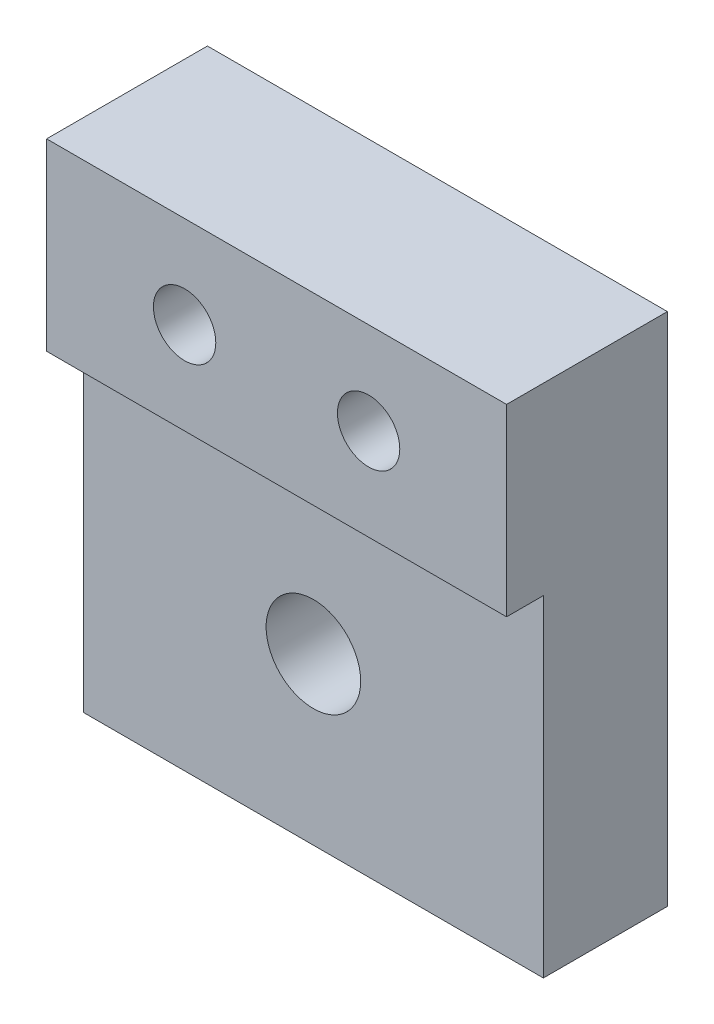
ISO-10303-21;
HEADER;
FILE_DESCRIPTION(('STEP AP214'),'2;1');
FILE_NAME('part.step','',(''),(''),'','','');
FILE_SCHEMA(('AUTOMOTIVE_DESIGN { 1 0 10303 214 1 1 1 1 }'));
ENDSEC;
DATA;
#1=APPLICATION_CONTEXT('core data for automotive mechanical design processes');
#2=APPLICATION_PROTOCOL_DEFINITION('international standard','automotive_design',2000,#1);
#3=PRODUCT_CONTEXT('',#1,'mechanical');
#4=PRODUCT('Part','Part','',(#3));
#5=PRODUCT_RELATED_PRODUCT_CATEGORY('part','',(#4));
#6=PRODUCT_DEFINITION_FORMATION('','',#4);
#7=PRODUCT_DEFINITION_CONTEXT('part definition',#1,'design');
#8=PRODUCT_DEFINITION('design','',#6,#7);
#9=PRODUCT_DEFINITION_SHAPE('','',#8);
#10=(LENGTH_UNIT() NAMED_UNIT(*) SI_UNIT(.MILLI.,.METRE.));
#11=(NAMED_UNIT(*) PLANE_ANGLE_UNIT() SI_UNIT($,.RADIAN.));
#12=(NAMED_UNIT(*) SI_UNIT($,.STERADIAN.) SOLID_ANGLE_UNIT());
#13=UNCERTAINTY_MEASURE_WITH_UNIT(LENGTH_MEASURE(1.E-05),#10,'distance_accuracy_value','');
#14=(GEOMETRIC_REPRESENTATION_CONTEXT(3) GLOBAL_UNCERTAINTY_ASSIGNED_CONTEXT((#13)) GLOBAL_UNIT_ASSIGNED_CONTEXT((#10,
#11,#12)) REPRESENTATION_CONTEXT('',''));
#15=CARTESIAN_POINT('',(0.,0.,0.));
#16=DIRECTION('',(0.,0.,1.));
#17=DIRECTION('',(1.,0.,0.));
#18=AXIS2_PLACEMENT_3D('',#15,#16,#17);
#19=CARTESIAN_POINT('',(0.,35.56,11.0998));
#20=DIRECTION('',(0.,1.,0.));
#21=DIRECTION('',(0.,0.,1.));
#22=AXIS2_PLACEMENT_3D('',#19,#20,#21);
#23=PLANE('',#22);
#24=DIRECTION('',(1.,0.,0.));
#25=VECTOR('',#24,1.);
#26=CARTESIAN_POINT('',(0.,35.56,0.));
#27=LINE('',#26,#25);
#28=CARTESIAN_POINT('',(0.,35.56,0.));
#29=VERTEX_POINT('',#28);
#30=CARTESIAN_POINT('',(31.75,35.56,0.));
#31=VERTEX_POINT('',#30);
#32=EDGE_CURVE('E148',#29,#31,#27,.T.);
#33=ORIENTED_EDGE('',*,*,#32,.F.);
#34=DIRECTION('',(0.,0.,-1.));
#35=VECTOR('',#34,1.);
#36=CARTESIAN_POINT('',(0.,35.56,11.0998));
#37=LINE('',#36,#35);
#38=CARTESIAN_POINT('',(0.,35.56,11.0998));
#39=VERTEX_POINT('',#38);
#40=EDGE_CURVE('E11',#39,#29,#37,.T.);
#41=ORIENTED_EDGE('',*,*,#40,.F.);
#42=DIRECTION('',(1.,0.,0.));
#43=VECTOR('',#42,1.);
#44=CARTESIAN_POINT('',(0.,35.56,11.0998));
#45=LINE('',#44,#43);
#46=CARTESIAN_POINT('',(31.75,35.56,11.0998));
#47=VERTEX_POINT('',#46);
#48=EDGE_CURVE('E138',#39,#47,#45,.T.);
#49=ORIENTED_EDGE('',*,*,#48,.T.);
#50=DIRECTION('',(0.,0.,-1.));
#51=VECTOR('',#50,1.);
#52=CARTESIAN_POINT('',(31.75,35.56,11.0998));
#53=LINE('',#52,#51);
#54=EDGE_CURVE('E80',#47,#31,#53,.T.);
#55=ORIENTED_EDGE('',*,*,#54,.T.);
#56=EDGE_LOOP('',(#33,#41,#49,#55));
#57=FACE_BOUND('',#56,.T.);
#58=ADVANCED_FACE('F42',(#57),#23,.T.);
#59=CARTESIAN_POINT('',(0.,0.,11.0998));
#60=DIRECTION('',(1.,0.,0.));
#61=DIRECTION('',(0.,1.,0.));
#62=AXIS2_PLACEMENT_3D('',#59,#60,#61);
#63=PLANE('',#62);
#64=DIRECTION('',(0.,-1.,0.));
#65=VECTOR('',#64,1.);
#66=CARTESIAN_POINT('',(0.,0.,0.));
#67=LINE('',#66,#65);
#68=CARTESIAN_POINT('',(0.,0.,0.));
#69=VERTEX_POINT('',#68);
#70=EDGE_CURVE('E121',#29,#69,#67,.T.);
#71=ORIENTED_EDGE('',*,*,#70,.T.);
#72=DIRECTION('',(0.,0.,-1.));
#73=VECTOR('',#72,1.);
#74=CARTESIAN_POINT('',(0.,0.,8.5598));
#75=LINE('',#74,#73);
#76=CARTESIAN_POINT('',(0.,0.,8.5598));
#77=VERTEX_POINT('',#76);
#78=EDGE_CURVE('E107',#77,#69,#75,.T.);
#79=ORIENTED_EDGE('',*,*,#78,.F.);
#80=DIRECTION('',(0.,-1.,0.));
#81=VECTOR('',#80,1.);
#82=CARTESIAN_POINT('',(0.,0.,8.5598));
#83=LINE('',#82,#81);
#84=CARTESIAN_POINT('',(0.,22.86,8.5598));
#85=VERTEX_POINT('',#84);
#86=EDGE_CURVE('E110',#85,#77,#83,.T.);
#87=ORIENTED_EDGE('',*,*,#86,.F.);
#88=DIRECTION('',(0.,0.,-1.));
#89=VECTOR('',#88,1.);
#90=CARTESIAN_POINT('',(0.,22.86,11.0998));
#91=LINE('',#90,#89);
#92=CARTESIAN_POINT('',(0.,22.86,11.0998));
#93=VERTEX_POINT('',#92);
#94=EDGE_CURVE('E50',#93,#85,#91,.T.);
#95=ORIENTED_EDGE('',*,*,#94,.F.);
#96=DIRECTION('',(0.,-1.,0.));
#97=VECTOR('',#96,1.);
#98=CARTESIAN_POINT('',(0.,0.,11.0998));
#99=LINE('',#98,#97);
#100=EDGE_CURVE('E140',#39,#93,#99,.T.);
#101=ORIENTED_EDGE('',*,*,#100,.F.);
#102=ORIENTED_EDGE('',*,*,#40,.T.);
#103=EDGE_LOOP('',(#71,#79,#87,#95,#101,#102));
#104=FACE_BOUND('',#103,.T.);
#105=ADVANCED_FACE('F119',(#104),#63,.F.);
#106=CARTESIAN_POINT('',(0.,22.86,11.0998));
#107=DIRECTION('',(0.,1.,0.));
#108=DIRECTION('',(0.,0.,1.));
#109=AXIS2_PLACEMENT_3D('',#106,#107,#108);
#110=PLANE('',#109);
#111=ORIENTED_EDGE('',*,*,#94,.T.);
#112=DIRECTION('',(1.,0.,0.));
#113=VECTOR('',#112,1.);
#114=CARTESIAN_POINT('',(0.,22.86,8.5598));
#115=LINE('',#114,#113);
#116=CARTESIAN_POINT('',(31.75,22.86,8.5598));
#117=VERTEX_POINT('',#116);
#118=EDGE_CURVE('E113',#85,#117,#115,.T.);
#119=ORIENTED_EDGE('',*,*,#118,.T.);
#120=DIRECTION('',(0.,0.,-1.));
#121=VECTOR('',#120,1.);
#122=CARTESIAN_POINT('',(31.75,22.86,11.0998));
#123=LINE('',#122,#121);
#124=CARTESIAN_POINT('',(31.75,22.86,11.0998));
#125=VERTEX_POINT('',#124);
#126=EDGE_CURVE('E154',#125,#117,#123,.T.);
#127=ORIENTED_EDGE('',*,*,#126,.F.);
#128=DIRECTION('',(1.,0.,0.));
#129=VECTOR('',#128,1.);
#130=CARTESIAN_POINT('',(0.,22.86,11.0998));
#131=LINE('',#130,#129);
#132=EDGE_CURVE('E143',#93,#125,#131,.T.);
#133=ORIENTED_EDGE('',*,*,#132,.F.);
#134=EDGE_LOOP('',(#111,#119,#127,#133));
#135=FACE_BOUND('',#134,.T.);
#136=ADVANCED_FACE('F157',(#135),#110,.F.);
#137=CARTESIAN_POINT('',(22.225,29.21,11.0998));
#138=DIRECTION('',(0.,0.,-1.));
#139=DIRECTION('',(-1.,0.,0.));
#140=AXIS2_PLACEMENT_3D('',#137,#138,#139);
#141=CYLINDRICAL_SURFACE('',#140,2.15265);
#142=CARTESIAN_POINT('',(22.225,29.21,11.0998));
#143=DIRECTION('',(0.,0.,1.));
#144=DIRECTION('',(1.,0.,0.));
#145=AXIS2_PLACEMENT_3D('',#142,#143,#144);
#146=CIRCLE('',#145,2.15265);
#147=CARTESIAN_POINT('',(24.37765,29.21,11.0998));
#148=VERTEX_POINT('',#147);
#149=EDGE_CURVE('E134',#148,#148,#146,.T.);
#150=ORIENTED_EDGE('',*,*,#149,.T.);
#151=EDGE_LOOP('',(#150));
#152=FACE_BOUND('',#151,.T.);
#153=CARTESIAN_POINT('',(22.225,29.21,0.));
#154=DIRECTION('',(0.,0.,1.));
#155=DIRECTION('',(1.,0.,0.));
#156=AXIS2_PLACEMENT_3D('',#153,#154,#155);
#157=CIRCLE('',#156,2.15265);
#158=CARTESIAN_POINT('',(24.37765,29.21,0.));
#159=VERTEX_POINT('',#158);
#160=EDGE_CURVE('E126',#159,#159,#157,.T.);
#161=ORIENTED_EDGE('',*,*,#160,.F.);
#162=EDGE_LOOP('',(#161));
#163=FACE_BOUND('',#162,.T.);
#164=ADVANCED_FACE('F168',(#152,#163),#141,.F.);
#165=CARTESIAN_POINT('',(9.52500000000001,29.21,11.0998));
#166=DIRECTION('',(0.,0.,-1.));
#167=DIRECTION('',(-1.,0.,0.));
#168=AXIS2_PLACEMENT_3D('',#165,#166,#167);
#169=CYLINDRICAL_SURFACE('',#168,2.15265);
#170=CARTESIAN_POINT('',(9.52500000000001,29.21,11.0998));
#171=DIRECTION('',(0.,0.,1.));
#172=DIRECTION('',(1.,0.,0.));
#173=AXIS2_PLACEMENT_3D('',#170,#171,#172);
#174=CIRCLE('',#173,2.15265);
#175=CARTESIAN_POINT('',(11.67765,29.21,11.0998));
#176=VERTEX_POINT('',#175);
#177=EDGE_CURVE('E131',#176,#176,#174,.T.);
#178=ORIENTED_EDGE('',*,*,#177,.T.);
#179=EDGE_LOOP('',(#178));
#180=FACE_BOUND('',#179,.T.);
#181=CARTESIAN_POINT('',(9.52500000000001,29.21,0.));
#182=DIRECTION('',(0.,0.,1.));
#183=DIRECTION('',(1.,0.,0.));
#184=AXIS2_PLACEMENT_3D('',#181,#182,#183);
#185=CIRCLE('',#184,2.15265);
#186=CARTESIAN_POINT('',(11.67765,29.21,0.));
#187=VERTEX_POINT('',#186);
#188=EDGE_CURVE('E123',#187,#187,#185,.T.);
#189=ORIENTED_EDGE('',*,*,#188,.F.);
#190=EDGE_LOOP('',(#189));
#191=FACE_BOUND('',#190,.T.);
#192=ADVANCED_FACE('F44',(#180,#191),#169,.F.);
#193=CARTESIAN_POINT('',(31.75,0.,11.0998));
#194=DIRECTION('',(-1.,0.,0.));
#195=DIRECTION('',(0.,0.,1.));
#196=AXIS2_PLACEMENT_3D('',#193,#194,#195);
#197=PLANE('',#196);
#198=DIRECTION('',(0.,1.,0.));
#199=VECTOR('',#198,1.);
#200=CARTESIAN_POINT('',(31.75,0.,0.));
#201=LINE('',#200,#199);
#202=CARTESIAN_POINT('',(31.75,0.,0.));
#203=VERTEX_POINT('',#202);
#204=EDGE_CURVE('E135',#203,#31,#201,.T.);
#205=ORIENTED_EDGE('',*,*,#204,.T.);
#206=ORIENTED_EDGE('',*,*,#54,.F.);
#207=DIRECTION('',(0.,1.,0.));
#208=VECTOR('',#207,1.);
#209=CARTESIAN_POINT('',(31.75,0.,11.0998));
#210=LINE('',#209,#208);
#211=EDGE_CURVE('E66',#125,#47,#210,.T.);
#212=ORIENTED_EDGE('',*,*,#211,.F.);
#213=ORIENTED_EDGE('',*,*,#126,.T.);
#214=DIRECTION('',(0.,1.,0.));
#215=VECTOR('',#214,1.);
#216=CARTESIAN_POINT('',(31.75,0.,8.5598));
#217=LINE('',#216,#215);
#218=CARTESIAN_POINT('',(31.75,0.,8.5598));
#219=VERTEX_POINT('',#218);
#220=EDGE_CURVE('E57',#219,#117,#217,.T.);
#221=ORIENTED_EDGE('',*,*,#220,.F.);
#222=DIRECTION('',(0.,0.,-1.));
#223=VECTOR('',#222,1.);
#224=CARTESIAN_POINT('',(31.75,0.,8.5598));
#225=LINE('',#224,#223);
#226=EDGE_CURVE('E109',#219,#203,#225,.T.);
#227=ORIENTED_EDGE('',*,*,#226,.T.);
#228=EDGE_LOOP('',(#205,#206,#212,#213,#221,#227));
#229=FACE_BOUND('',#228,.T.);
#230=ADVANCED_FACE('F173',(#229),#197,.F.);
#231=CARTESIAN_POINT('',(0.,0.,11.0998));
#232=DIRECTION('',(0.,0.,1.));
#233=DIRECTION('',(1.,0.,0.));
#234=AXIS2_PLACEMENT_3D('',#231,#232,#233);
#235=PLANE('',#234);
#236=ORIENTED_EDGE('',*,*,#177,.F.);
#237=EDGE_LOOP('',(#236));
#238=FACE_BOUND('',#237,.T.);
#239=ORIENTED_EDGE('',*,*,#149,.F.);
#240=EDGE_LOOP('',(#239));
#241=FACE_BOUND('',#240,.T.);
#242=ORIENTED_EDGE('',*,*,#48,.F.);
#243=ORIENTED_EDGE('',*,*,#100,.T.);
#244=ORIENTED_EDGE('',*,*,#132,.T.);
#245=ORIENTED_EDGE('',*,*,#211,.T.);
#246=EDGE_LOOP('',(#242,#243,#244,#245));
#247=FACE_BOUND('',#246,.T.);
#248=ADVANCED_FACE('F159',(#238,#241,#247),#235,.T.);
#249=CARTESIAN_POINT('',(0.,0.,0.));
#250=DIRECTION('',(0.,0.,1.));
#251=DIRECTION('',(1.,0.,0.));
#252=AXIS2_PLACEMENT_3D('',#249,#250,#251);
#253=PLANE('',#252);
#254=ORIENTED_EDGE('',*,*,#188,.T.);
#255=EDGE_LOOP('',(#254));
#256=FACE_BOUND('',#255,.T.);
#257=ORIENTED_EDGE('',*,*,#160,.T.);
#258=EDGE_LOOP('',(#257));
#259=FACE_BOUND('',#258,.T.);
#260=ORIENTED_EDGE('',*,*,#32,.T.);
#261=ORIENTED_EDGE('',*,*,#204,.F.);
#262=DIRECTION('',(1.,0.,0.));
#263=VECTOR('',#262,1.);
#264=CARTESIAN_POINT('',(0.,0.,0.));
#265=LINE('',#264,#263);
#266=EDGE_CURVE('E190',#69,#203,#265,.T.);
#267=ORIENTED_EDGE('',*,*,#266,.F.);
#268=ORIENTED_EDGE('',*,*,#70,.F.);
#269=EDGE_LOOP('',(#260,#261,#267,#268));
#270=FACE_BOUND('',#269,.T.);
#271=CARTESIAN_POINT('',(15.875,11.43,0.));
#272=DIRECTION('',(0.,0.,1.));
#273=DIRECTION('',(1.,0.,0.));
#274=AXIS2_PLACEMENT_3D('',#271,#272,#273);
#275=CIRCLE('',#274,3.2639);
#276=CARTESIAN_POINT('',(19.1389,11.43,0.));
#277=VERTEX_POINT('',#276);
#278=EDGE_CURVE('E188',#277,#277,#275,.T.);
#279=ORIENTED_EDGE('',*,*,#278,.T.);
#280=EDGE_LOOP('',(#279));
#281=FACE_BOUND('',#280,.T.);
#282=ADVANCED_FACE('F180',(#256,#259,#270,#281),#253,.F.);
#283=CARTESIAN_POINT('',(0.,0.,8.5598));
#284=DIRECTION('',(0.,1.,0.));
#285=DIRECTION('',(0.,0.,1.));
#286=AXIS2_PLACEMENT_3D('',#283,#284,#285);
#287=PLANE('',#286);
#288=ORIENTED_EDGE('',*,*,#266,.T.);
#289=ORIENTED_EDGE('',*,*,#226,.F.);
#290=DIRECTION('',(1.,0.,0.));
#291=VECTOR('',#290,1.);
#292=CARTESIAN_POINT('',(0.,0.,8.5598));
#293=LINE('',#292,#291);
#294=EDGE_CURVE('E102',#77,#219,#293,.T.);
#295=ORIENTED_EDGE('',*,*,#294,.F.);
#296=ORIENTED_EDGE('',*,*,#78,.T.);
#297=EDGE_LOOP('',(#288,#289,#295,#296));
#298=FACE_BOUND('',#297,.T.);
#299=ADVANCED_FACE('F105',(#298),#287,.F.);
#300=CARTESIAN_POINT('',(15.875,11.43,8.5598));
#301=DIRECTION('',(0.,0.,-1.));
#302=DIRECTION('',(-1.,0.,0.));
#303=AXIS2_PLACEMENT_3D('',#300,#301,#302);
#304=CYLINDRICAL_SURFACE('',#303,3.2639);
#305=CARTESIAN_POINT('',(15.875,11.43,8.5598));
#306=DIRECTION('',(0.,0.,1.));
#307=DIRECTION('',(1.,0.,0.));
#308=AXIS2_PLACEMENT_3D('',#305,#306,#307);
#309=CIRCLE('',#308,3.2639);
#310=CARTESIAN_POINT('',(19.1389,11.43,8.5598));
#311=VERTEX_POINT('',#310);
#312=EDGE_CURVE('E117',#311,#311,#309,.T.);
#313=ORIENTED_EDGE('',*,*,#312,.T.);
#314=EDGE_LOOP('',(#313));
#315=FACE_BOUND('',#314,.T.);
#316=ORIENTED_EDGE('',*,*,#278,.F.);
#317=EDGE_LOOP('',(#316));
#318=FACE_BOUND('',#317,.T.);
#319=ADVANCED_FACE('F198',(#315,#318),#304,.F.);
#320=CARTESIAN_POINT('',(0.,0.,8.5598));
#321=DIRECTION('',(0.,0.,1.));
#322=DIRECTION('',(1.,0.,0.));
#323=AXIS2_PLACEMENT_3D('',#320,#321,#322);
#324=PLANE('',#323);
#325=ORIENTED_EDGE('',*,*,#312,.F.);
#326=EDGE_LOOP('',(#325));
#327=FACE_BOUND('',#326,.T.);
#328=ORIENTED_EDGE('',*,*,#86,.T.);
#329=ORIENTED_EDGE('',*,*,#294,.T.);
#330=ORIENTED_EDGE('',*,*,#220,.T.);
#331=ORIENTED_EDGE('',*,*,#118,.F.);
#332=EDGE_LOOP('',(#328,#329,#330,#331));
#333=FACE_BOUND('',#332,.T.);
#334=ADVANCED_FACE('F112',(#327,#333),#324,.T.);
#335=CLOSED_SHELL('',(#58,#105,#136,#164,#192,#230,#248,#282,#299,#319,#334));
#336=MANIFOLD_SOLID_BREP('B2',#335);
#337=ADVANCED_BREP_SHAPE_REPRESENTATION('',(#18,#336),#14);
#338=SHAPE_DEFINITION_REPRESENTATION(#9,#337);
ENDSEC;
END-ISO-10303-21;
